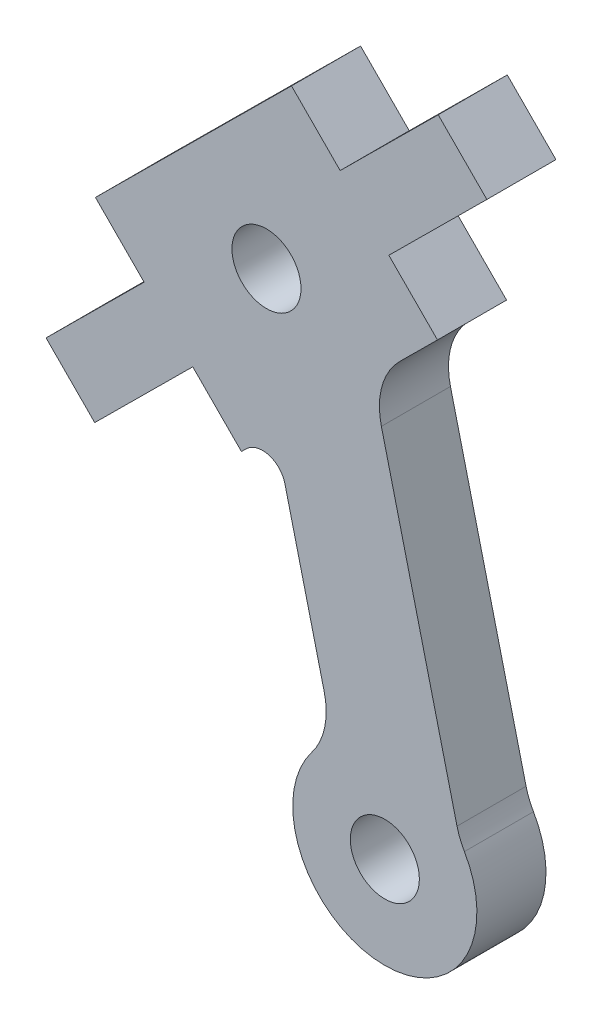
ISO-10303-21;
HEADER;
FILE_DESCRIPTION(('STEP AP214'),'2;1');
FILE_NAME('part.step','',(''),(''),'','','');
FILE_SCHEMA(('AUTOMOTIVE_DESIGN { 1 0 10303 214 1 1 1 1 }'));
ENDSEC;
DATA;
#1=APPLICATION_CONTEXT('core data for automotive mechanical design processes');
#2=APPLICATION_PROTOCOL_DEFINITION('international standard','automotive_design',2000,#1);
#3=PRODUCT_CONTEXT('',#1,'mechanical');
#4=PRODUCT('Part','Part','',(#3));
#5=PRODUCT_RELATED_PRODUCT_CATEGORY('part','',(#4));
#6=PRODUCT_DEFINITION_FORMATION('','',#4);
#7=PRODUCT_DEFINITION_CONTEXT('part definition',#1,'design');
#8=PRODUCT_DEFINITION('design','',#6,#7);
#9=PRODUCT_DEFINITION_SHAPE('','',#8);
#10=(LENGTH_UNIT() NAMED_UNIT(*) SI_UNIT(.MILLI.,.METRE.));
#11=(NAMED_UNIT(*) PLANE_ANGLE_UNIT() SI_UNIT($,.RADIAN.));
#12=(NAMED_UNIT(*) SI_UNIT($,.STERADIAN.) SOLID_ANGLE_UNIT());
#13=UNCERTAINTY_MEASURE_WITH_UNIT(LENGTH_MEASURE(1.E-05),#10,'distance_accuracy_value','');
#14=(GEOMETRIC_REPRESENTATION_CONTEXT(3) GLOBAL_UNCERTAINTY_ASSIGNED_CONTEXT((#13)) GLOBAL_UNIT_ASSIGNED_CONTEXT((#10,
#11,#12)) REPRESENTATION_CONTEXT('',''));
#15=CARTESIAN_POINT('',(0.,0.,0.));
#16=DIRECTION('',(0.,0.,1.));
#17=DIRECTION('',(1.,0.,0.));
#18=AXIS2_PLACEMENT_3D('',#15,#16,#17);
#19=CARTESIAN_POINT('',(165.896808391357,-58.5061970483647,3.));
#20=DIRECTION('',(0.,0.,-1.));
#21=DIRECTION('',(-1.,0.,0.));
#22=AXIS2_PLACEMENT_3D('',#19,#20,#21);
#23=PLANE('',#22);
#24=CARTESIAN_POINT('',(157.991505021172,-55.7859737381093,3.));
#25=DIRECTION('',(0.,0.,1.));
#26=DIRECTION('',(1.,0.,0.));
#27=AXIS2_PLACEMENT_3D('',#24,#25,#26);
#28=CIRCLE('',#27,1.49999999999993);
#29=CARTESIAN_POINT('',(159.491505021172,-55.7859737381093,3.));
#30=VERTEX_POINT('',#29);
#31=EDGE_CURVE('E210',#30,#30,#28,.T.);
#32=ORIENTED_EDGE('',*,*,#31,.F.);
#33=EDGE_LOOP('',(#32));
#34=FACE_BOUND('',#33,.T.);
#35=DIRECTION('',(-0.709673386532728,-0.704530825760781,0.));
#36=VECTOR('',#35,1.);
#37=CARTESIAN_POINT('',(148.418628144138,-63.1758335674393,3.));
#38=LINE('',#37,#36);
#39=CARTESIAN_POINT('',(152.676668463335,-58.9486486128746,3.));
#40=VERTEX_POINT('',#39);
#41=CARTESIAN_POINT('',(148.418628144138,-63.1758335674393,3.));
#42=VERTEX_POINT('',#41);
#43=EDGE_CURVE('E245',#40,#42,#38,.T.);
#44=ORIENTED_EDGE('',*,*,#43,.T.);
#45=DIRECTION('',(0.704530825760761,-0.709673386532749,0.));
#46=VECTOR('',#45,1.);
#47=CARTESIAN_POINT('',(148.418628144138,-63.1758335674393,3.));
#48=LINE('',#47,#46);
#49=CARTESIAN_POINT('',(150.532220621421,-65.3048537270377,3.));
#50=VERTEX_POINT('',#49);
#51=EDGE_CURVE('E133',#42,#50,#48,.T.);
#52=ORIENTED_EDGE('',*,*,#51,.T.);
#53=DIRECTION('',(0.709673386532727,0.704530825760783,0.));
#54=VECTOR('',#53,1.);
#55=CARTESIAN_POINT('',(150.532220621421,-65.3048537270377,3.));
#56=LINE('',#55,#54);
#57=CARTESIAN_POINT('',(154.790260940617,-61.077668772473,3.));
#58=VERTEX_POINT('',#57);
#59=EDGE_CURVE('E296',#50,#58,#56,.T.);
#60=ORIENTED_EDGE('',*,*,#59,.T.);
#61=DIRECTION('',(0.704530825760801,-0.709673386532709,0.));
#62=VECTOR('',#61,1.);
#63=CARTESIAN_POINT('',(154.790260940617,-61.077668772473,3.));
#64=LINE('',#63,#62);
#65=CARTESIAN_POINT('',(156.9038534179,-63.2066889320712,3.));
#66=VERTEX_POINT('',#65);
#67=EDGE_CURVE('E315',#58,#66,#64,.T.);
#68=ORIENTED_EDGE('',*,*,#67,.T.);
#69=DIRECTION('',(0.709673386532735,0.704530825760775,0.));
#70=VECTOR('',#69,1.);
#71=CARTESIAN_POINT('',(157.114961915874,-62.9971102058211,3.));
#72=LINE('',#71,#70);
#73=CARTESIAN_POINT('',(157.114961915874,-62.9971102058211,3.));
#74=VERTEX_POINT('',#73);
#75=EDGE_CURVE('E312',#66,#74,#72,.T.);
#76=ORIENTED_EDGE('',*,*,#75,.T.);
#77=CARTESIAN_POINT('',(157.819492741635,-63.7067835923539,3.));
#78=DIRECTION('',(0.,0.,-1.));
#79=DIRECTION('',(1.,0.,0.));
#80=AXIS2_PLACEMENT_3D('',#77,#78,#79);
#81=CIRCLE('',#80,0.999999999999992);
#82=CARTESIAN_POINT('',(158.790743402017,-63.4687244511574,3.));
#83=VERTEX_POINT('',#82);
#84=EDGE_CURVE('E314',#74,#83,#81,.T.);
#85=ORIENTED_EDGE('',*,*,#84,.T.);
#86=DIRECTION('',(0.23805914119648,-0.971250660382166,0.));
#87=VECTOR('',#86,1.);
#88=CARTESIAN_POINT('',(160.499830137411,-70.4415783901359,3.));
#89=LINE('',#88,#87);
#90=CARTESIAN_POINT('',(160.499830137411,-70.4415783901359,3.));
#91=VERTEX_POINT('',#90);
#92=EDGE_CURVE('E317',#83,#91,#89,.T.);
#93=ORIENTED_EDGE('',*,*,#92,.T.);
#94=CARTESIAN_POINT('',(157.586078156264,-71.1557558137254,3.));
#95=DIRECTION('',(0.,0.,-1.));
#96=DIRECTION('',(-1.,0.,0.));
#97=AXIS2_PLACEMENT_3D('',#94,#95,#96);
#98=CIRCLE('',#97,3.00000000000001);
#99=CARTESIAN_POINT('',(159.963165382659,-72.9859078068969,3.));
#100=VERTEX_POINT('',#99);
#101=EDGE_CURVE('E323',#91,#100,#98,.T.);
#102=ORIENTED_EDGE('',*,*,#101,.T.);
#103=CARTESIAN_POINT('',(163.132615017853,-75.426110464459,3.));
#104=DIRECTION('',(0.,0.,1.));
#105=DIRECTION('',(1.,0.,0.));
#106=AXIS2_PLACEMENT_3D('',#103,#104,#105);
#107=CIRCLE('',#106,3.99999999999999);
#108=CARTESIAN_POINT('',(166.589129615952,-73.4130265533605,3.));
#109=VERTEX_POINT('',#108);
#110=EDGE_CURVE('E325',#100,#109,#107,.T.);
#111=ORIENTED_EDGE('',*,*,#110,.T.);
#112=CARTESIAN_POINT('',(169.181515564527,-71.9032136200366,3.));
#113=DIRECTION('',(0.,0.,-1.));
#114=DIRECTION('',(-1.,0.,0.));
#115=AXIS2_PLACEMENT_3D('',#112,#113,#114);
#116=CIRCLE('',#115,3.);
#117=CARTESIAN_POINT('',(166.267814939031,-72.617600535499,3.));
#118=VERTEX_POINT('',#117);
#119=EDGE_CURVE('E327',#109,#118,#116,.T.);
#120=ORIENTED_EDGE('',*,*,#119,.T.);
#121=DIRECTION('',(-0.238128971820808,0.971233541832017,0.));
#122=VECTOR('',#121,1.);
#123=CARTESIAN_POINT('',(166.267814939031,-72.617600535499,3.));
#124=LINE('',#123,#122);
#125=CARTESIAN_POINT('',(162.983107765861,-59.2205839638271,3.));
#126=VERTEX_POINT('',#125);
#127=EDGE_CURVE('E329',#118,#126,#124,.T.);
#128=ORIENTED_EDGE('',*,*,#127,.T.);
#129=CARTESIAN_POINT('',(165.896808391357,-58.5061970483647,3.));
#130=DIRECTION('',(0.,0.,-1.));
#131=DIRECTION('',(-1.,0.,0.));
#132=AXIS2_PLACEMENT_3D('',#129,#130,#131);
#133=CIRCLE('',#132,3.00000000000001);
#134=CARTESIAN_POINT('',(163.783215914075,-56.3771768887664,3.));
#135=VERTEX_POINT('',#134);
#136=EDGE_CURVE('E331',#126,#135,#133,.T.);
#137=ORIENTED_EDGE('',*,*,#136,.T.);
#138=DIRECTION('',(0.709673386532739,0.70453082576077,0.));
#139=VECTOR('',#138,1.);
#140=CARTESIAN_POINT('',(165.419934056292,-54.7523190229419,3.));
#141=LINE('',#140,#139);
#142=CARTESIAN_POINT('',(165.419934056292,-54.7523190229419,3.));
#143=VERTEX_POINT('',#142);
#144=EDGE_CURVE('E333',#135,#143,#141,.T.);
#145=ORIENTED_EDGE('',*,*,#144,.T.);
#146=DIRECTION('',(-0.704530825760793,0.709673386532717,0.));
#147=VECTOR('',#146,1.);
#148=CARTESIAN_POINT('',(163.30634157901,-52.6232988633435,3.));
#149=LINE('',#148,#147);
#150=CARTESIAN_POINT('',(163.30634157901,-52.6232988633435,3.));
#151=VERTEX_POINT('',#150);
#152=EDGE_CURVE('E335',#143,#151,#149,.T.);
#153=ORIENTED_EDGE('',*,*,#152,.T.);
#154=DIRECTION('',(0.709673386532728,0.704530825760782,0.));
#155=VECTOR('',#154,1.);
#156=CARTESIAN_POINT('',(163.30634157901,-52.6232988633435,3.));
#157=LINE('',#156,#155);
#158=CARTESIAN_POINT('',(167.564381898206,-48.3961139087789,3.));
#159=VERTEX_POINT('',#158);
#160=EDGE_CURVE('E337',#151,#159,#157,.T.);
#161=ORIENTED_EDGE('',*,*,#160,.T.);
#162=DIRECTION('',(-0.704530825760746,0.709673386532763,0.));
#163=VECTOR('',#162,1.);
#164=CARTESIAN_POINT('',(165.450789420924,-46.2670937491808,3.));
#165=LINE('',#164,#163);
#166=CARTESIAN_POINT('',(165.450789420924,-46.2670937491808,3.));
#167=VERTEX_POINT('',#166);
#168=EDGE_CURVE('E339',#159,#167,#165,.T.);
#169=ORIENTED_EDGE('',*,*,#168,.T.);
#170=DIRECTION('',(-0.709673386532737,-0.704530825760773,0.));
#171=VECTOR('',#170,1.);
#172=CARTESIAN_POINT('',(161.192749101728,-50.4942787037454,3.));
#173=LINE('',#172,#171);
#174=CARTESIAN_POINT('',(161.192749101728,-50.4942787037454,3.));
#175=VERTEX_POINT('',#174);
#176=EDGE_CURVE('E188',#167,#175,#173,.T.);
#177=ORIENTED_EDGE('',*,*,#176,.T.);
#178=DIRECTION('',(-0.704530825760772,0.709673386532738,0.));
#179=VECTOR('',#178,1.);
#180=CARTESIAN_POINT('',(159.079156624445,-48.3652585441473,3.));
#181=LINE('',#180,#179);
#182=CARTESIAN_POINT('',(159.079156624445,-48.3652585441473,3.));
#183=VERTEX_POINT('',#182);
#184=EDGE_CURVE('E182',#175,#183,#181,.T.);
#185=ORIENTED_EDGE('',*,*,#184,.T.);
#186=DIRECTION('',(-0.709673386532738,-0.704530825760772,0.));
#187=VECTOR('',#186,1.);
#188=CARTESIAN_POINT('',(159.079156624445,-48.3652585441473,3.));
#189=LINE('',#188,#187);
#190=CARTESIAN_POINT('',(150.563075986053,-56.8196284532765,3.));
#191=VERTEX_POINT('',#190);
#192=EDGE_CURVE('E186',#183,#191,#189,.T.);
#193=ORIENTED_EDGE('',*,*,#192,.T.);
#194=DIRECTION('',(0.704530825760767,-0.709673386532742,0.));
#195=VECTOR('',#194,1.);
#196=CARTESIAN_POINT('',(150.563075986053,-56.8196284532765,3.));
#197=LINE('',#196,#195);
#198=EDGE_CURVE('E54',#191,#40,#197,.T.);
#199=ORIENTED_EDGE('',*,*,#198,.T.);
#200=EDGE_LOOP('',(#44,#52,#60,#68,#76,#85,#93,#102,#111,#120,#128,#137,#145,#153,#161,#169,
#177,#185,#193,#199));
#201=FACE_BOUND('',#200,.T.);
#202=CARTESIAN_POINT('',(163.132615017853,-75.426110464459,3.));
#203=DIRECTION('',(0.,0.,1.));
#204=DIRECTION('',(1.,0.,0.));
#205=AXIS2_PLACEMENT_3D('',#202,#203,#204);
#206=CIRCLE('',#205,1.5);
#207=CARTESIAN_POINT('',(164.632615017853,-75.426110464459,3.));
#208=VERTEX_POINT('',#207);
#209=EDGE_CURVE('E382',#208,#208,#206,.T.);
#210=ORIENTED_EDGE('',*,*,#209,.F.);
#211=EDGE_LOOP('',(#210));
#212=FACE_BOUND('',#211,.T.);
#213=ADVANCED_FACE('F37',(#34,#201,#212),#23,.F.);
#214=CARTESIAN_POINT('',(165.896808391357,-58.5061970483647,0.));
#215=DIRECTION('',(0.,0.,-1.));
#216=DIRECTION('',(-1.,0.,0.));
#217=AXIS2_PLACEMENT_3D('',#214,#215,#216);
#218=PLANE('',#217);
#219=CARTESIAN_POINT('',(157.991505021172,-55.7859737381093,0.));
#220=DIRECTION('',(0.,0.,1.));
#221=DIRECTION('',(1.,0.,0.));
#222=AXIS2_PLACEMENT_3D('',#219,#220,#221);
#223=CIRCLE('',#222,1.49999999999993);
#224=CARTESIAN_POINT('',(159.491505021172,-55.7859737381093,0.));
#225=VERTEX_POINT('',#224);
#226=EDGE_CURVE('E387',#225,#225,#223,.T.);
#227=ORIENTED_EDGE('',*,*,#226,.T.);
#228=EDGE_LOOP('',(#227));
#229=FACE_BOUND('',#228,.T.);
#230=DIRECTION('',(-0.709673386532728,-0.704530825760781,0.));
#231=VECTOR('',#230,1.);
#232=CARTESIAN_POINT('',(148.418628144138,-63.1758335674393,0.));
#233=LINE('',#232,#231);
#234=CARTESIAN_POINT('',(152.676668463335,-58.9486486128746,0.));
#235=VERTEX_POINT('',#234);
#236=CARTESIAN_POINT('',(148.418628144138,-63.1758335674393,0.));
#237=VERTEX_POINT('',#236);
#238=EDGE_CURVE('E206',#235,#237,#233,.T.);
#239=ORIENTED_EDGE('',*,*,#238,.F.);
#240=DIRECTION('',(0.704530825760767,-0.709673386532742,0.));
#241=VECTOR('',#240,1.);
#242=CARTESIAN_POINT('',(150.563075986053,-56.8196284532765,0.));
#243=LINE('',#242,#241);
#244=CARTESIAN_POINT('',(150.563075986053,-56.8196284532765,0.));
#245=VERTEX_POINT('',#244);
#246=EDGE_CURVE('E125',#245,#235,#243,.T.);
#247=ORIENTED_EDGE('',*,*,#246,.F.);
#248=DIRECTION('',(-0.709673386532738,-0.704530825760772,0.));
#249=VECTOR('',#248,1.);
#250=CARTESIAN_POINT('',(159.079156624445,-48.3652585441473,0.));
#251=LINE('',#250,#249);
#252=CARTESIAN_POINT('',(159.079156624445,-48.3652585441473,0.));
#253=VERTEX_POINT('',#252);
#254=EDGE_CURVE('E119',#253,#245,#251,.T.);
#255=ORIENTED_EDGE('',*,*,#254,.F.);
#256=DIRECTION('',(-0.704530825760772,0.709673386532738,0.));
#257=VECTOR('',#256,1.);
#258=CARTESIAN_POINT('',(159.079156624445,-48.3652585441473,0.));
#259=LINE('',#258,#257);
#260=CARTESIAN_POINT('',(161.192749101728,-50.4942787037454,0.));
#261=VERTEX_POINT('',#260);
#262=EDGE_CURVE('E196',#261,#253,#259,.T.);
#263=ORIENTED_EDGE('',*,*,#262,.F.);
#264=DIRECTION('',(-0.709673386532737,-0.704530825760773,0.));
#265=VECTOR('',#264,1.);
#266=CARTESIAN_POINT('',(161.192749101728,-50.4942787037454,0.));
#267=LINE('',#266,#265);
#268=CARTESIAN_POINT('',(165.450789420924,-46.2670937491808,0.));
#269=VERTEX_POINT('',#268);
#270=EDGE_CURVE('E240',#269,#261,#267,.T.);
#271=ORIENTED_EDGE('',*,*,#270,.F.);
#272=DIRECTION('',(-0.704530825760746,0.709673386532763,0.));
#273=VECTOR('',#272,1.);
#274=CARTESIAN_POINT('',(165.450789420924,-46.2670937491808,0.));
#275=LINE('',#274,#273);
#276=CARTESIAN_POINT('',(167.564381898206,-48.3961139087789,0.));
#277=VERTEX_POINT('',#276);
#278=EDGE_CURVE('E238',#277,#269,#275,.T.);
#279=ORIENTED_EDGE('',*,*,#278,.F.);
#280=DIRECTION('',(0.709673386532728,0.704530825760782,0.));
#281=VECTOR('',#280,1.);
#282=CARTESIAN_POINT('',(163.30634157901,-52.6232988633435,0.));
#283=LINE('',#282,#281);
#284=CARTESIAN_POINT('',(163.30634157901,-52.6232988633435,0.));
#285=VERTEX_POINT('',#284);
#286=EDGE_CURVE('E236',#285,#277,#283,.T.);
#287=ORIENTED_EDGE('',*,*,#286,.F.);
#288=DIRECTION('',(-0.704530825760793,0.709673386532717,0.));
#289=VECTOR('',#288,1.);
#290=CARTESIAN_POINT('',(163.30634157901,-52.6232988633435,0.));
#291=LINE('',#290,#289);
#292=CARTESIAN_POINT('',(165.419934056292,-54.7523190229419,0.));
#293=VERTEX_POINT('',#292);
#294=EDGE_CURVE('E234',#293,#285,#291,.T.);
#295=ORIENTED_EDGE('',*,*,#294,.F.);
#296=DIRECTION('',(0.709673386532739,0.70453082576077,0.));
#297=VECTOR('',#296,1.);
#298=CARTESIAN_POINT('',(165.419934056292,-54.7523190229419,0.));
#299=LINE('',#298,#297);
#300=CARTESIAN_POINT('',(163.783215914075,-56.3771768887664,0.));
#301=VERTEX_POINT('',#300);
#302=EDGE_CURVE('E232',#301,#293,#299,.T.);
#303=ORIENTED_EDGE('',*,*,#302,.F.);
#304=CARTESIAN_POINT('',(165.896808391357,-58.5061970483647,0.));
#305=DIRECTION('',(0.,0.,-1.));
#306=DIRECTION('',(-1.,0.,0.));
#307=AXIS2_PLACEMENT_3D('',#304,#305,#306);
#308=CIRCLE('',#307,3.00000000000001);
#309=CARTESIAN_POINT('',(162.983107765861,-59.2205839638271,0.));
#310=VERTEX_POINT('',#309);
#311=EDGE_CURVE('E230',#310,#301,#308,.T.);
#312=ORIENTED_EDGE('',*,*,#311,.F.);
#313=DIRECTION('',(-0.238128971820808,0.971233541832017,0.));
#314=VECTOR('',#313,1.);
#315=CARTESIAN_POINT('',(166.267814939031,-72.617600535499,0.));
#316=LINE('',#315,#314);
#317=CARTESIAN_POINT('',(166.267814939031,-72.617600535499,0.));
#318=VERTEX_POINT('',#317);
#319=EDGE_CURVE('E228',#318,#310,#316,.T.);
#320=ORIENTED_EDGE('',*,*,#319,.F.);
#321=CARTESIAN_POINT('',(169.181515564527,-71.9032136200366,0.));
#322=DIRECTION('',(0.,0.,-1.));
#323=DIRECTION('',(-1.,0.,0.));
#324=AXIS2_PLACEMENT_3D('',#321,#322,#323);
#325=CIRCLE('',#324,3.);
#326=CARTESIAN_POINT('',(166.589129615952,-73.4130265533605,0.));
#327=VERTEX_POINT('',#326);
#328=EDGE_CURVE('E226',#327,#318,#325,.T.);
#329=ORIENTED_EDGE('',*,*,#328,.F.);
#330=CARTESIAN_POINT('',(163.132615017853,-75.426110464459,0.));
#331=DIRECTION('',(0.,0.,1.));
#332=DIRECTION('',(1.,0.,0.));
#333=AXIS2_PLACEMENT_3D('',#330,#331,#332);
#334=CIRCLE('',#333,3.99999999999999);
#335=CARTESIAN_POINT('',(159.963165382659,-72.9859078068969,0.));
#336=VERTEX_POINT('',#335);
#337=EDGE_CURVE('E224',#336,#327,#334,.T.);
#338=ORIENTED_EDGE('',*,*,#337,.F.);
#339=CARTESIAN_POINT('',(157.586078156264,-71.1557558137254,0.));
#340=DIRECTION('',(0.,0.,-1.));
#341=DIRECTION('',(-1.,0.,0.));
#342=AXIS2_PLACEMENT_3D('',#339,#340,#341);
#343=CIRCLE('',#342,3.00000000000001);
#344=CARTESIAN_POINT('',(160.499830137411,-70.4415783901359,0.));
#345=VERTEX_POINT('',#344);
#346=EDGE_CURVE('E222',#345,#336,#343,.T.);
#347=ORIENTED_EDGE('',*,*,#346,.F.);
#348=DIRECTION('',(0.23805914119648,-0.971250660382166,0.));
#349=VECTOR('',#348,1.);
#350=CARTESIAN_POINT('',(160.499830137411,-70.4415783901359,0.));
#351=LINE('',#350,#349);
#352=CARTESIAN_POINT('',(158.790743402017,-63.4687244511574,0.));
#353=VERTEX_POINT('',#352);
#354=EDGE_CURVE('E220',#353,#345,#351,.T.);
#355=ORIENTED_EDGE('',*,*,#354,.F.);
#356=CARTESIAN_POINT('',(157.819492741635,-63.7067835923539,0.));
#357=DIRECTION('',(0.,0.,-1.));
#358=DIRECTION('',(1.,0.,0.));
#359=AXIS2_PLACEMENT_3D('',#356,#357,#358);
#360=CIRCLE('',#359,0.999999999999992);
#361=CARTESIAN_POINT('',(157.114961915874,-62.9971102058211,0.));
#362=VERTEX_POINT('',#361);
#363=EDGE_CURVE('E218',#362,#353,#360,.T.);
#364=ORIENTED_EDGE('',*,*,#363,.F.);
#365=DIRECTION('',(0.709673386532735,0.704530825760775,0.));
#366=VECTOR('',#365,1.);
#367=CARTESIAN_POINT('',(157.114961915874,-62.9971102058211,0.));
#368=LINE('',#367,#366);
#369=CARTESIAN_POINT('',(156.9038534179,-63.2066889320712,0.));
#370=VERTEX_POINT('',#369);
#371=EDGE_CURVE('E216',#370,#362,#368,.T.);
#372=ORIENTED_EDGE('',*,*,#371,.F.);
#373=DIRECTION('',(0.704530825760801,-0.709673386532709,0.));
#374=VECTOR('',#373,1.);
#375=CARTESIAN_POINT('',(154.790260940617,-61.077668772473,0.));
#376=LINE('',#375,#374);
#377=CARTESIAN_POINT('',(154.790260940617,-61.077668772473,0.));
#378=VERTEX_POINT('',#377);
#379=EDGE_CURVE('E214',#378,#370,#376,.T.);
#380=ORIENTED_EDGE('',*,*,#379,.F.);
#381=DIRECTION('',(0.709673386532727,0.704530825760783,0.));
#382=VECTOR('',#381,1.);
#383=CARTESIAN_POINT('',(150.532220621421,-65.3048537270377,0.));
#384=LINE('',#383,#382);
#385=CARTESIAN_POINT('',(150.532220621421,-65.3048537270377,0.));
#386=VERTEX_POINT('',#385);
#387=EDGE_CURVE('E212',#386,#378,#384,.T.);
#388=ORIENTED_EDGE('',*,*,#387,.F.);
#389=DIRECTION('',(0.704530825760761,-0.709673386532749,0.));
#390=VECTOR('',#389,1.);
#391=CARTESIAN_POINT('',(148.418628144138,-63.1758335674393,0.));
#392=LINE('',#391,#390);
#393=EDGE_CURVE('E209',#237,#386,#392,.T.);
#394=ORIENTED_EDGE('',*,*,#393,.F.);
#395=EDGE_LOOP('',(#239,#247,#255,#263,#271,#279,#287,#295,#303,#312,#320,#329,#338,#347,#355,
#364,#372,#380,#388,#394));
#396=FACE_BOUND('',#395,.T.);
#397=CARTESIAN_POINT('',(163.132615017853,-75.426110464459,0.));
#398=DIRECTION('',(0.,0.,1.));
#399=DIRECTION('',(1.,0.,0.));
#400=AXIS2_PLACEMENT_3D('',#397,#398,#399);
#401=CIRCLE('',#400,1.5);
#402=CARTESIAN_POINT('',(164.632615017853,-75.426110464459,0.));
#403=VERTEX_POINT('',#402);
#404=EDGE_CURVE('E385',#403,#403,#401,.T.);
#405=ORIENTED_EDGE('',*,*,#404,.T.);
#406=EDGE_LOOP('',(#405));
#407=FACE_BOUND('',#406,.T.);
#408=ADVANCED_FACE('F300',(#229,#396,#407),#218,.T.);
#409=CARTESIAN_POINT('',(148.418628144138,-63.1758335674393,3.));
#410=DIRECTION('',(0.704530825760782,-0.709673386532728,0.));
#411=DIRECTION('',(0.709673386532728,0.704530825760782,0.));
#412=AXIS2_PLACEMENT_3D('',#409,#410,#411);
#413=PLANE('',#412);
#414=ORIENTED_EDGE('',*,*,#238,.T.);
#415=DIRECTION('',(0.,0.,-1.));
#416=VECTOR('',#415,1.);
#417=CARTESIAN_POINT('',(148.418628144138,-63.1758335674393,3.));
#418=LINE('',#417,#416);
#419=EDGE_CURVE('E11',#42,#237,#418,.T.);
#420=ORIENTED_EDGE('',*,*,#419,.F.);
#421=ORIENTED_EDGE('',*,*,#43,.F.);
#422=DIRECTION('',(0.,0.,-1.));
#423=VECTOR('',#422,1.);
#424=CARTESIAN_POINT('',(152.676668463335,-58.9486486128746,3.));
#425=LINE('',#424,#423);
#426=EDGE_CURVE('E202',#40,#235,#425,.T.);
#427=ORIENTED_EDGE('',*,*,#426,.T.);
#428=EDGE_LOOP('',(#414,#420,#421,#427));
#429=FACE_BOUND('',#428,.T.);
#430=ADVANCED_FACE('F39',(#429),#413,.F.);
#431=CARTESIAN_POINT('',(148.418628144138,-63.1758335674393,3.));
#432=DIRECTION('',(0.709673386532749,0.704530825760761,0.));
#433=DIRECTION('',(-0.704530825760761,0.709673386532749,0.));
#434=AXIS2_PLACEMENT_3D('',#431,#432,#433);
#435=PLANE('',#434);
#436=ORIENTED_EDGE('',*,*,#393,.T.);
#437=DIRECTION('',(0.,0.,-1.));
#438=VECTOR('',#437,1.);
#439=CARTESIAN_POINT('',(150.532220621421,-65.3048537270377,3.));
#440=LINE('',#439,#438);
#441=EDGE_CURVE('E46',#50,#386,#440,.T.);
#442=ORIENTED_EDGE('',*,*,#441,.F.);
#443=ORIENTED_EDGE('',*,*,#51,.F.);
#444=ORIENTED_EDGE('',*,*,#419,.T.);
#445=EDGE_LOOP('',(#436,#442,#443,#444));
#446=FACE_BOUND('',#445,.T.);
#447=ADVANCED_FACE('F560',(#446),#435,.F.);
#448=CARTESIAN_POINT('',(150.532220621421,-65.3048537270377,3.));
#449=DIRECTION('',(-0.704530825760783,0.709673386532727,0.));
#450=DIRECTION('',(-0.709673386532727,-0.704530825760783,0.));
#451=AXIS2_PLACEMENT_3D('',#448,#449,#450);
#452=PLANE('',#451);
#453=ORIENTED_EDGE('',*,*,#387,.T.);
#454=DIRECTION('',(0.,0.,-1.));
#455=VECTOR('',#454,1.);
#456=CARTESIAN_POINT('',(154.790260940617,-61.077668772473,3.));
#457=LINE('',#456,#455);
#458=EDGE_CURVE('E288',#58,#378,#457,.T.);
#459=ORIENTED_EDGE('',*,*,#458,.F.);
#460=ORIENTED_EDGE('',*,*,#59,.F.);
#461=ORIENTED_EDGE('',*,*,#441,.T.);
#462=EDGE_LOOP('',(#453,#459,#460,#461));
#463=FACE_BOUND('',#462,.T.);
#464=ADVANCED_FACE('F294',(#463),#452,.F.);
#465=CARTESIAN_POINT('',(154.790260940617,-61.077668772473,3.));
#466=DIRECTION('',(0.709673386532709,0.704530825760801,0.));
#467=DIRECTION('',(-0.704530825760801,0.709673386532709,0.));
#468=AXIS2_PLACEMENT_3D('',#465,#466,#467);
#469=PLANE('',#468);
#470=ORIENTED_EDGE('',*,*,#379,.T.);
#471=DIRECTION('',(0.,0.,-1.));
#472=VECTOR('',#471,1.);
#473=CARTESIAN_POINT('',(156.9038534179,-63.2066889320712,3.));
#474=LINE('',#473,#472);
#475=EDGE_CURVE('E285',#66,#370,#474,.T.);
#476=ORIENTED_EDGE('',*,*,#475,.F.);
#477=ORIENTED_EDGE('',*,*,#67,.F.);
#478=ORIENTED_EDGE('',*,*,#458,.T.);
#479=EDGE_LOOP('',(#470,#476,#477,#478));
#480=FACE_BOUND('',#479,.T.);
#481=ADVANCED_FACE('F306',(#480),#469,.F.);
#482=CARTESIAN_POINT('',(157.114961915874,-62.9971102058211,3.));
#483=DIRECTION('',(-0.704530825760775,0.709673386532735,0.));
#484=DIRECTION('',(-0.709673386532735,-0.704530825760775,0.));
#485=AXIS2_PLACEMENT_3D('',#482,#483,#484);
#486=PLANE('',#485);
#487=ORIENTED_EDGE('',*,*,#371,.T.);
#488=DIRECTION('',(0.,0.,-1.));
#489=VECTOR('',#488,1.);
#490=CARTESIAN_POINT('',(157.114961915874,-62.9971102058211,3.));
#491=LINE('',#490,#489);
#492=EDGE_CURVE('E282',#74,#362,#491,.T.);
#493=ORIENTED_EDGE('',*,*,#492,.F.);
#494=ORIENTED_EDGE('',*,*,#75,.F.);
#495=ORIENTED_EDGE('',*,*,#475,.T.);
#496=EDGE_LOOP('',(#487,#493,#494,#495));
#497=FACE_BOUND('',#496,.T.);
#498=ADVANCED_FACE('F310',(#497),#486,.F.);
#499=CARTESIAN_POINT('',(157.819492741635,-63.7067835923539,3.));
#500=DIRECTION('',(0.,0.,-1.));
#501=DIRECTION('',(-1.,0.,0.));
#502=AXIS2_PLACEMENT_3D('',#499,#500,#501);
#503=CYLINDRICAL_SURFACE('',#502,0.999999999999992);
#504=ORIENTED_EDGE('',*,*,#363,.T.);
#505=DIRECTION('',(0.,0.,-1.));
#506=VECTOR('',#505,1.);
#507=CARTESIAN_POINT('',(158.790743402017,-63.4687244511574,3.));
#508=LINE('',#507,#506);
#509=EDGE_CURVE('E279',#83,#353,#508,.T.);
#510=ORIENTED_EDGE('',*,*,#509,.F.);
#511=ORIENTED_EDGE('',*,*,#84,.F.);
#512=ORIENTED_EDGE('',*,*,#492,.T.);
#513=EDGE_LOOP('',(#504,#510,#511,#512));
#514=FACE_BOUND('',#513,.T.);
#515=ADVANCED_FACE('F525',(#514),#503,.F.);
#516=CARTESIAN_POINT('',(160.499830137411,-70.4415783901359,3.));
#517=DIRECTION('',(0.971250660382166,0.23805914119648,0.));
#518=DIRECTION('',(-0.23805914119648,0.971250660382167,0.));
#519=AXIS2_PLACEMENT_3D('',#516,#517,#518);
#520=PLANE('',#519);
#521=ORIENTED_EDGE('',*,*,#354,.T.);
#522=DIRECTION('',(0.,0.,-1.));
#523=VECTOR('',#522,1.);
#524=CARTESIAN_POINT('',(160.499830137411,-70.4415783901359,3.));
#525=LINE('',#524,#523);
#526=EDGE_CURVE('E276',#91,#345,#525,.T.);
#527=ORIENTED_EDGE('',*,*,#526,.F.);
#528=ORIENTED_EDGE('',*,*,#92,.F.);
#529=ORIENTED_EDGE('',*,*,#509,.T.);
#530=EDGE_LOOP('',(#521,#527,#528,#529));
#531=FACE_BOUND('',#530,.T.);
#532=ADVANCED_FACE('F515',(#531),#520,.F.);
#533=CARTESIAN_POINT('',(157.586078156264,-71.1557558137254,3.));
#534=DIRECTION('',(0.,0.,-1.));
#535=DIRECTION('',(-1.,0.,0.));
#536=AXIS2_PLACEMENT_3D('',#533,#534,#535);
#537=CYLINDRICAL_SURFACE('',#536,3.00000000000001);
#538=ORIENTED_EDGE('',*,*,#346,.T.);
#539=DIRECTION('',(0.,0.,-1.));
#540=VECTOR('',#539,1.);
#541=CARTESIAN_POINT('',(159.963165382659,-72.9859078068969,3.));
#542=LINE('',#541,#540);
#543=EDGE_CURVE('E273',#100,#336,#542,.T.);
#544=ORIENTED_EDGE('',*,*,#543,.F.);
#545=ORIENTED_EDGE('',*,*,#101,.F.);
#546=ORIENTED_EDGE('',*,*,#526,.T.);
#547=EDGE_LOOP('',(#538,#544,#545,#546));
#548=FACE_BOUND('',#547,.T.);
#549=ADVANCED_FACE('F505',(#548),#537,.F.);
#550=CARTESIAN_POINT('',(163.132615017853,-75.426110464459,3.));
#551=DIRECTION('',(0.,0.,-1.));
#552=DIRECTION('',(-1.,0.,0.));
#553=AXIS2_PLACEMENT_3D('',#550,#551,#552);
#554=CYLINDRICAL_SURFACE('',#553,3.99999999999999);
#555=ORIENTED_EDGE('',*,*,#337,.T.);
#556=DIRECTION('',(0.,0.,-1.));
#557=VECTOR('',#556,1.);
#558=CARTESIAN_POINT('',(166.589129615952,-73.4130265533605,3.));
#559=LINE('',#558,#557);
#560=EDGE_CURVE('E270',#109,#327,#559,.T.);
#561=ORIENTED_EDGE('',*,*,#560,.F.);
#562=ORIENTED_EDGE('',*,*,#110,.F.);
#563=ORIENTED_EDGE('',*,*,#543,.T.);
#564=EDGE_LOOP('',(#555,#561,#562,#563));
#565=FACE_BOUND('',#564,.T.);
#566=ADVANCED_FACE('F495',(#565),#554,.T.);
#567=CARTESIAN_POINT('',(169.181515564527,-71.9032136200366,3.));
#568=DIRECTION('',(0.,0.,-1.));
#569=DIRECTION('',(-1.,0.,0.));
#570=AXIS2_PLACEMENT_3D('',#567,#568,#569);
#571=CYLINDRICAL_SURFACE('',#570,3.);
#572=ORIENTED_EDGE('',*,*,#328,.T.);
#573=DIRECTION('',(0.,0.,-1.));
#574=VECTOR('',#573,1.);
#575=CARTESIAN_POINT('',(166.267814939031,-72.617600535499,3.));
#576=LINE('',#575,#574);
#577=EDGE_CURVE('E267',#118,#318,#576,.T.);
#578=ORIENTED_EDGE('',*,*,#577,.F.);
#579=ORIENTED_EDGE('',*,*,#119,.F.);
#580=ORIENTED_EDGE('',*,*,#560,.T.);
#581=EDGE_LOOP('',(#572,#578,#579,#580));
#582=FACE_BOUND('',#581,.T.);
#583=ADVANCED_FACE('F485',(#582),#571,.F.);
#584=CARTESIAN_POINT('',(166.267814939031,-72.617600535499,3.));
#585=DIRECTION('',(-0.971233541832017,-0.238128971820808,0.));
#586=DIRECTION('',(0.238128971820808,-0.971233541832017,0.));
#587=AXIS2_PLACEMENT_3D('',#584,#585,#586);
#588=PLANE('',#587);
#589=ORIENTED_EDGE('',*,*,#319,.T.);
#590=DIRECTION('',(0.,0.,-1.));
#591=VECTOR('',#590,1.);
#592=CARTESIAN_POINT('',(162.983107765861,-59.2205839638271,3.));
#593=LINE('',#592,#591);
#594=EDGE_CURVE('E264',#126,#310,#593,.T.);
#595=ORIENTED_EDGE('',*,*,#594,.F.);
#596=ORIENTED_EDGE('',*,*,#127,.F.);
#597=ORIENTED_EDGE('',*,*,#577,.T.);
#598=EDGE_LOOP('',(#589,#595,#596,#597));
#599=FACE_BOUND('',#598,.T.);
#600=ADVANCED_FACE('F475',(#599),#588,.F.);
#601=CARTESIAN_POINT('',(165.896808391357,-58.5061970483647,3.));
#602=DIRECTION('',(0.,0.,-1.));
#603=DIRECTION('',(-1.,0.,0.));
#604=AXIS2_PLACEMENT_3D('',#601,#602,#603);
#605=CYLINDRICAL_SURFACE('',#604,3.00000000000001);
#606=ORIENTED_EDGE('',*,*,#311,.T.);
#607=DIRECTION('',(0.,0.,-1.));
#608=VECTOR('',#607,1.);
#609=CARTESIAN_POINT('',(163.783215914075,-56.3771768887664,3.));
#610=LINE('',#609,#608);
#611=EDGE_CURVE('E261',#135,#301,#610,.T.);
#612=ORIENTED_EDGE('',*,*,#611,.F.);
#613=ORIENTED_EDGE('',*,*,#136,.F.);
#614=ORIENTED_EDGE('',*,*,#594,.T.);
#615=EDGE_LOOP('',(#606,#612,#613,#614));
#616=FACE_BOUND('',#615,.T.);
#617=ADVANCED_FACE('F465',(#616),#605,.F.);
#618=CARTESIAN_POINT('',(165.419934056292,-54.7523190229419,3.));
#619=DIRECTION('',(-0.704530825760771,0.709673386532739,0.));
#620=DIRECTION('',(-0.709673386532739,-0.704530825760771,0.));
#621=AXIS2_PLACEMENT_3D('',#618,#619,#620);
#622=PLANE('',#621);
#623=ORIENTED_EDGE('',*,*,#302,.T.);
#624=DIRECTION('',(0.,0.,-1.));
#625=VECTOR('',#624,1.);
#626=CARTESIAN_POINT('',(165.419934056292,-54.7523190229419,3.));
#627=LINE('',#626,#625);
#628=EDGE_CURVE('E258',#143,#293,#627,.T.);
#629=ORIENTED_EDGE('',*,*,#628,.F.);
#630=ORIENTED_EDGE('',*,*,#144,.F.);
#631=ORIENTED_EDGE('',*,*,#611,.T.);
#632=EDGE_LOOP('',(#623,#629,#630,#631));
#633=FACE_BOUND('',#632,.T.);
#634=ADVANCED_FACE('F455',(#633),#622,.F.);
#635=CARTESIAN_POINT('',(163.30634157901,-52.6232988633435,3.));
#636=DIRECTION('',(-0.709673386532717,-0.704530825760793,0.));
#637=DIRECTION('',(0.704530825760793,-0.709673386532717,0.));
#638=AXIS2_PLACEMENT_3D('',#635,#636,#637);
#639=PLANE('',#638);
#640=ORIENTED_EDGE('',*,*,#294,.T.);
#641=DIRECTION('',(0.,0.,-1.));
#642=VECTOR('',#641,1.);
#643=CARTESIAN_POINT('',(163.30634157901,-52.6232988633435,3.));
#644=LINE('',#643,#642);
#645=EDGE_CURVE('E255',#151,#285,#644,.T.);
#646=ORIENTED_EDGE('',*,*,#645,.F.);
#647=ORIENTED_EDGE('',*,*,#152,.F.);
#648=ORIENTED_EDGE('',*,*,#628,.T.);
#649=EDGE_LOOP('',(#640,#646,#647,#648));
#650=FACE_BOUND('',#649,.T.);
#651=ADVANCED_FACE('F445',(#650),#639,.F.);
#652=CARTESIAN_POINT('',(163.30634157901,-52.6232988633435,3.));
#653=DIRECTION('',(-0.704530825760782,0.709673386532728,0.));
#654=DIRECTION('',(-0.709673386532728,-0.704530825760782,0.));
#655=AXIS2_PLACEMENT_3D('',#652,#653,#654);
#656=PLANE('',#655);
#657=ORIENTED_EDGE('',*,*,#286,.T.);
#658=DIRECTION('',(0.,0.,-1.));
#659=VECTOR('',#658,1.);
#660=CARTESIAN_POINT('',(167.564381898206,-48.3961139087789,3.));
#661=LINE('',#660,#659);
#662=EDGE_CURVE('E252',#159,#277,#661,.T.);
#663=ORIENTED_EDGE('',*,*,#662,.F.);
#664=ORIENTED_EDGE('',*,*,#160,.F.);
#665=ORIENTED_EDGE('',*,*,#645,.T.);
#666=EDGE_LOOP('',(#657,#663,#664,#665));
#667=FACE_BOUND('',#666,.T.);
#668=ADVANCED_FACE('F436',(#667),#656,.F.);
#669=CARTESIAN_POINT('',(165.450789420924,-46.2670937491808,3.));
#670=DIRECTION('',(-0.709673386532763,-0.704530825760746,0.));
#671=DIRECTION('',(0.704530825760746,-0.709673386532763,0.));
#672=AXIS2_PLACEMENT_3D('',#669,#670,#671);
#673=PLANE('',#672);
#674=ORIENTED_EDGE('',*,*,#278,.T.);
#675=DIRECTION('',(0.,0.,-1.));
#676=VECTOR('',#675,1.);
#677=CARTESIAN_POINT('',(165.450789420924,-46.2670937491808,3.));
#678=LINE('',#677,#676);
#679=EDGE_CURVE('E249',#167,#269,#678,.T.);
#680=ORIENTED_EDGE('',*,*,#679,.F.);
#681=ORIENTED_EDGE('',*,*,#168,.F.);
#682=ORIENTED_EDGE('',*,*,#662,.T.);
#683=EDGE_LOOP('',(#674,#680,#681,#682));
#684=FACE_BOUND('',#683,.T.);
#685=ADVANCED_FACE('F345',(#684),#673,.F.);
#686=CARTESIAN_POINT('',(161.192749101728,-50.4942787037454,3.));
#687=DIRECTION('',(0.704530825760773,-0.709673386532737,0.));
#688=DIRECTION('',(0.709673386532737,0.704530825760773,0.));
#689=AXIS2_PLACEMENT_3D('',#686,#687,#688);
#690=PLANE('',#689);
#691=ORIENTED_EDGE('',*,*,#270,.T.);
#692=DIRECTION('',(0.,0.,-1.));
#693=VECTOR('',#692,1.);
#694=CARTESIAN_POINT('',(161.192749101728,-50.4942787037454,3.));
#695=LINE('',#694,#693);
#696=EDGE_CURVE('E197',#175,#261,#695,.T.);
#697=ORIENTED_EDGE('',*,*,#696,.F.);
#698=ORIENTED_EDGE('',*,*,#176,.F.);
#699=ORIENTED_EDGE('',*,*,#679,.T.);
#700=EDGE_LOOP('',(#691,#697,#698,#699));
#701=FACE_BOUND('',#700,.T.);
#702=ADVANCED_FACE('F349',(#701),#690,.F.);
#703=CARTESIAN_POINT('',(159.079156624445,-48.3652585441473,3.));
#704=DIRECTION('',(-0.709673386532738,-0.704530825760772,0.));
#705=DIRECTION('',(0.704530825760772,-0.709673386532738,0.));
#706=AXIS2_PLACEMENT_3D('',#703,#704,#705);
#707=PLANE('',#706);
#708=ORIENTED_EDGE('',*,*,#262,.T.);
#709=DIRECTION('',(0.,0.,-1.));
#710=VECTOR('',#709,1.);
#711=CARTESIAN_POINT('',(159.079156624445,-48.3652585441473,3.));
#712=LINE('',#711,#710);
#713=EDGE_CURVE('E193',#183,#253,#712,.T.);
#714=ORIENTED_EDGE('',*,*,#713,.F.);
#715=ORIENTED_EDGE('',*,*,#184,.F.);
#716=ORIENTED_EDGE('',*,*,#696,.T.);
#717=EDGE_LOOP('',(#708,#714,#715,#716));
#718=FACE_BOUND('',#717,.T.);
#719=ADVANCED_FACE('F194',(#718),#707,.F.);
#720=CARTESIAN_POINT('',(159.079156624445,-48.3652585441473,3.));
#721=DIRECTION('',(0.704530825760771,-0.709673386532738,0.));
#722=DIRECTION('',(0.709673386532738,0.704530825760772,0.));
#723=AXIS2_PLACEMENT_3D('',#720,#721,#722);
#724=PLANE('',#723);
#725=ORIENTED_EDGE('',*,*,#254,.T.);
#726=DIRECTION('',(0.,0.,-1.));
#727=VECTOR('',#726,1.);
#728=CARTESIAN_POINT('',(150.563075986053,-56.8196284532765,3.));
#729=LINE('',#728,#727);
#730=EDGE_CURVE('E198',#191,#245,#729,.T.);
#731=ORIENTED_EDGE('',*,*,#730,.F.);
#732=ORIENTED_EDGE('',*,*,#192,.F.);
#733=ORIENTED_EDGE('',*,*,#713,.T.);
#734=EDGE_LOOP('',(#725,#731,#732,#733));
#735=FACE_BOUND('',#734,.T.);
#736=ADVANCED_FACE('F200',(#735),#724,.F.);
#737=CARTESIAN_POINT('',(150.563075986053,-56.8196284532765,3.));
#738=DIRECTION('',(0.709673386532742,0.704530825760767,0.));
#739=DIRECTION('',(-0.704530825760767,0.709673386532742,0.));
#740=AXIS2_PLACEMENT_3D('',#737,#738,#739);
#741=PLANE('',#740);
#742=ORIENTED_EDGE('',*,*,#246,.T.);
#743=ORIENTED_EDGE('',*,*,#426,.F.);
#744=ORIENTED_EDGE('',*,*,#198,.F.);
#745=ORIENTED_EDGE('',*,*,#730,.T.);
#746=EDGE_LOOP('',(#742,#743,#744,#745));
#747=FACE_BOUND('',#746,.T.);
#748=ADVANCED_FACE('F353',(#747),#741,.F.);
#749=CARTESIAN_POINT('',(157.991505021172,-55.7859737381093,3.));
#750=DIRECTION('',(0.,0.,-1.));
#751=DIRECTION('',(-1.,0.,0.));
#752=AXIS2_PLACEMENT_3D('',#749,#750,#751);
#753=CYLINDRICAL_SURFACE('',#752,1.49999999999993);
#754=ORIENTED_EDGE('',*,*,#31,.T.);
#755=EDGE_LOOP('',(#754));
#756=FACE_BOUND('',#755,.T.);
#757=ORIENTED_EDGE('',*,*,#226,.F.);
#758=EDGE_LOOP('',(#757));
#759=FACE_BOUND('',#758,.T.);
#760=ADVANCED_FACE('F355',(#756,#759),#753,.F.);
#761=CARTESIAN_POINT('',(163.132615017853,-75.426110464459,3.));
#762=DIRECTION('',(0.,0.,-1.));
#763=DIRECTION('',(-1.,0.,0.));
#764=AXIS2_PLACEMENT_3D('',#761,#762,#763);
#765=CYLINDRICAL_SURFACE('',#764,1.5);
#766=ORIENTED_EDGE('',*,*,#209,.T.);
#767=EDGE_LOOP('',(#766));
#768=FACE_BOUND('',#767,.T.);
#769=ORIENTED_EDGE('',*,*,#404,.F.);
#770=EDGE_LOOP('',(#769));
#771=FACE_BOUND('',#770,.T.);
#772=ADVANCED_FACE('F361',(#768,#771),#765,.F.);
#773=CLOSED_SHELL('',(#213,#408,#430,#447,#464,#481,#498,#515,#532,#549,#566,#583,#600,#617,
#634,#651,#668,#685,#702,#719,#736,#748,#760,#772));
#774=MANIFOLD_SOLID_BREP('B2',#773);
#775=ADVANCED_BREP_SHAPE_REPRESENTATION('',(#18,#774),#14);
#776=SHAPE_DEFINITION_REPRESENTATION(#9,#775);
ENDSEC;
END-ISO-10303-21;
